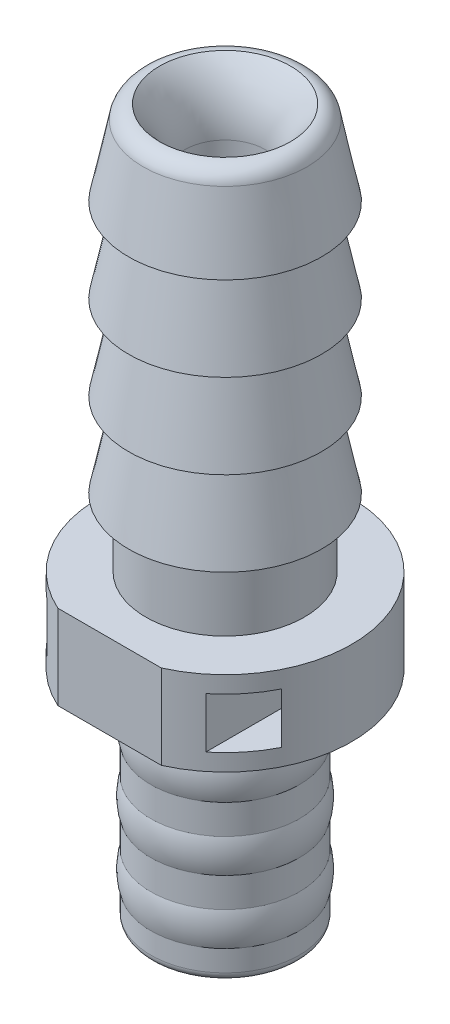
ISO-10303-21;
HEADER;
FILE_DESCRIPTION(('STEP AP214'),'2;1');
FILE_NAME('part.step','',(''),(''),'','','');
FILE_SCHEMA(('AUTOMOTIVE_DESIGN { 1 0 10303 214 1 1 1 1 }'));
ENDSEC;
DATA;
#1=APPLICATION_CONTEXT('core data for automotive mechanical design processes');
#2=APPLICATION_PROTOCOL_DEFINITION('international standard','automotive_design',2000,#1);
#3=PRODUCT_CONTEXT('',#1,'mechanical');
#4=PRODUCT('Part','Part','',(#3));
#5=PRODUCT_RELATED_PRODUCT_CATEGORY('part','',(#4));
#6=PRODUCT_DEFINITION_FORMATION('','',#4);
#7=PRODUCT_DEFINITION_CONTEXT('part definition',#1,'design');
#8=PRODUCT_DEFINITION('design','',#6,#7);
#9=PRODUCT_DEFINITION_SHAPE('','',#8);
#10=(LENGTH_UNIT() NAMED_UNIT(*) SI_UNIT(.MILLI.,.METRE.));
#11=(NAMED_UNIT(*) PLANE_ANGLE_UNIT() SI_UNIT($,.RADIAN.));
#12=(NAMED_UNIT(*) SI_UNIT($,.STERADIAN.) SOLID_ANGLE_UNIT());
#13=UNCERTAINTY_MEASURE_WITH_UNIT(LENGTH_MEASURE(1.E-05),#10,'distance_accuracy_value','');
#14=(GEOMETRIC_REPRESENTATION_CONTEXT(3) GLOBAL_UNCERTAINTY_ASSIGNED_CONTEXT((#13)) GLOBAL_UNIT_ASSIGNED_CONTEXT((#10,
#11,#12)) REPRESENTATION_CONTEXT('',''));
#15=CARTESIAN_POINT('',(0.,0.,0.));
#16=DIRECTION('',(0.,0.,1.));
#17=DIRECTION('',(1.,0.,0.));
#18=AXIS2_PLACEMENT_3D('',#15,#16,#17);
#19=CARTESIAN_POINT('',(0.,7.83692888110823,0.));
#20=DIRECTION('',(0.,-1.,0.));
#21=DIRECTION('',(0.,0.,-1.));
#22=AXIS2_PLACEMENT_3D('',#19,#20,#21);
#23=CYLINDRICAL_SURFACE('',#22,2.4);
#24=CARTESIAN_POINT('',(0.,38.4460627545706,0.));
#25=DIRECTION('',(0.,1.,0.));
#26=DIRECTION('',(0.,0.,1.));
#27=AXIS2_PLACEMENT_3D('',#24,#25,#26);
#28=CIRCLE('',#27,2.4);
#29=CARTESIAN_POINT('',(0.,38.4460627545706,2.4));
#30=VERTEX_POINT('',#29);
#31=EDGE_CURVE('E11',#30,#30,#28,.T.);
#32=ORIENTED_EDGE('',*,*,#31,.T.);
#33=EDGE_LOOP('',(#32));
#34=FACE_BOUND('',#33,.T.);
#35=CARTESIAN_POINT('',(0.,3.57071421427142,0.));
#36=DIRECTION('',(0.,-1.,0.));
#37=DIRECTION('',(0.,0.,-1.));
#38=AXIS2_PLACEMENT_3D('',#35,#36,#37);
#39=CIRCLE('',#38,2.4);
#40=CARTESIAN_POINT('',(0.,3.57071421427142,-2.4));
#41=VERTEX_POINT('',#40);
#42=EDGE_CURVE('E52',#41,#41,#39,.T.);
#43=ORIENTED_EDGE('',*,*,#42,.T.);
#44=EDGE_LOOP('',(#43));
#45=FACE_BOUND('',#44,.T.);
#46=ADVANCED_FACE('F43',(#34,#45),#23,.F.);
#47=CARTESIAN_POINT('',(0.,7.83692888110823,0.));
#48=DIRECTION('',(0.,-1.,0.));
#49=DIRECTION('',(0.,0.,-1.));
#50=AXIS2_PLACEMENT_3D('',#47,#48,#49);
#51=CYLINDRICAL_SURFACE('',#50,4.4);
#52=CARTESIAN_POINT('',(0.,0.5,0.));
#53=DIRECTION('',(0.,-1.,0.));
#54=DIRECTION('',(0.,0.,-1.));
#55=AXIS2_PLACEMENT_3D('',#52,#53,#54);
#56=CIRCLE('',#55,4.4);
#57=CARTESIAN_POINT('',(0.,0.5,-4.4));
#58=VERTEX_POINT('',#57);
#59=EDGE_CURVE('E198',#58,#58,#56,.F.);
#60=ORIENTED_EDGE('',*,*,#59,.T.);
#61=EDGE_LOOP('',(#60));
#62=FACE_BOUND('',#61,.T.);
#63=CARTESIAN_POINT('',(0.,1.75,0.));
#64=DIRECTION('',(0.,-1.,0.));
#65=DIRECTION('',(0.,0.,-1.));
#66=AXIS2_PLACEMENT_3D('',#63,#64,#65);
#67=CIRCLE('',#66,4.4);
#68=CARTESIAN_POINT('',(0.,1.75,-4.4));
#69=VERTEX_POINT('',#68);
#70=EDGE_CURVE('E182',#69,#69,#67,.T.);
#71=ORIENTED_EDGE('',*,*,#70,.T.);
#72=EDGE_LOOP('',(#71));
#73=FACE_BOUND('',#72,.T.);
#74=ADVANCED_FACE('F215',(#62,#73),#51,.T.);
#75=CARTESIAN_POINT('',(0.,2.75,0.));
#76=DIRECTION('',(0.,-1.,0.));
#77=DIRECTION('',(0.,0.,-1.));
#78=AXIS2_PLACEMENT_3D('',#75,#76,#77);
#79=DEGENERATE_TOROIDAL_SURFACE('',#78,1.14166666666668,3.40833333333332,.T.);
#80=CARTESIAN_POINT('',(0.,3.75,0.));
#81=DIRECTION('',(0.,-1.,0.));
#82=DIRECTION('',(0.,0.,-1.));
#83=AXIS2_PLACEMENT_3D('',#80,#81,#82);
#84=CIRCLE('',#83,4.4);
#85=CARTESIAN_POINT('',(0.,3.75,-4.4));
#86=VERTEX_POINT('',#85);
#87=EDGE_CURVE('E178',#86,#86,#84,.T.);
#88=ORIENTED_EDGE('',*,*,#87,.T.);
#89=EDGE_LOOP('',(#88));
#90=FACE_BOUND('',#89,.T.);
#91=ORIENTED_EDGE('',*,*,#70,.F.);
#92=EDGE_LOOP('',(#91));
#93=FACE_BOUND('',#92,.T.);
#94=ADVANCED_FACE('F221',(#90,#93),#79,.T.);
#95=CARTESIAN_POINT('',(0.,7.83692888110823,0.));
#96=DIRECTION('',(0.,-1.,0.));
#97=DIRECTION('',(0.,0.,-1.));
#98=AXIS2_PLACEMENT_3D('',#95,#96,#97);
#99=CYLINDRICAL_SURFACE('',#98,4.4);
#100=CARTESIAN_POINT('',(0.,5.5,0.));
#101=DIRECTION('',(0.,-1.,0.));
#102=DIRECTION('',(0.,0.,-1.));
#103=AXIS2_PLACEMENT_3D('',#100,#101,#102);
#104=CIRCLE('',#103,4.4);
#105=CARTESIAN_POINT('',(0.,5.5,-4.4));
#106=VERTEX_POINT('',#105);
#107=EDGE_CURVE('E174',#106,#106,#104,.T.);
#108=ORIENTED_EDGE('',*,*,#107,.T.);
#109=EDGE_LOOP('',(#108));
#110=FACE_BOUND('',#109,.T.);
#111=ORIENTED_EDGE('',*,*,#87,.F.);
#112=EDGE_LOOP('',(#111));
#113=FACE_BOUND('',#112,.T.);
#114=ADVANCED_FACE('F246',(#110,#113),#99,.T.);
#115=CARTESIAN_POINT('',(0.,6.5,0.));
#116=DIRECTION('',(0.,-1.,0.));
#117=DIRECTION('',(0.,0.,-1.));
#118=AXIS2_PLACEMENT_3D('',#115,#116,#117);
#119=DEGENERATE_TOROIDAL_SURFACE('',#118,1.14166666666668,3.40833333333332,.T.);
#120=CARTESIAN_POINT('',(0.,7.5,0.));
#121=DIRECTION('',(0.,-1.,0.));
#122=DIRECTION('',(0.,0.,-1.));
#123=AXIS2_PLACEMENT_3D('',#120,#121,#122);
#124=CIRCLE('',#123,4.4);
#125=CARTESIAN_POINT('',(0.,7.5,-4.4));
#126=VERTEX_POINT('',#125);
#127=EDGE_CURVE('E170',#126,#126,#124,.T.);
#128=ORIENTED_EDGE('',*,*,#127,.T.);
#129=EDGE_LOOP('',(#128));
#130=FACE_BOUND('',#129,.T.);
#131=ORIENTED_EDGE('',*,*,#107,.F.);
#132=EDGE_LOOP('',(#131));
#133=FACE_BOUND('',#132,.T.);
#134=ADVANCED_FACE('F251',(#130,#133),#119,.T.);
#135=CARTESIAN_POINT('',(0.,7.83692888110823,0.));
#136=DIRECTION('',(0.,-1.,0.));
#137=DIRECTION('',(0.,0.,-1.));
#138=AXIS2_PLACEMENT_3D('',#135,#136,#137);
#139=CYLINDRICAL_SURFACE('',#138,4.4);
#140=CARTESIAN_POINT('',(0.,9.25,0.));
#141=DIRECTION('',(0.,-1.,0.));
#142=DIRECTION('',(0.,0.,-1.));
#143=AXIS2_PLACEMENT_3D('',#140,#141,#142);
#144=CIRCLE('',#143,4.4);
#145=CARTESIAN_POINT('',(0.,9.25,-4.4));
#146=VERTEX_POINT('',#145);
#147=EDGE_CURVE('E166',#146,#146,#144,.T.);
#148=ORIENTED_EDGE('',*,*,#147,.T.);
#149=EDGE_LOOP('',(#148));
#150=FACE_BOUND('',#149,.T.);
#151=ORIENTED_EDGE('',*,*,#127,.F.);
#152=EDGE_LOOP('',(#151));
#153=FACE_BOUND('',#152,.T.);
#154=ADVANCED_FACE('F257',(#150,#153),#139,.T.);
#155=CARTESIAN_POINT('',(0.,10.25,0.));
#156=DIRECTION('',(0.,-1.,0.));
#157=DIRECTION('',(0.,0.,-1.));
#158=AXIS2_PLACEMENT_3D('',#155,#156,#157);
#159=DEGENERATE_TOROIDAL_SURFACE('',#158,1.14166666666668,3.40833333333332,.T.);
#160=CARTESIAN_POINT('',(0.,11.25,0.));
#161=DIRECTION('',(0.,-1.,0.));
#162=DIRECTION('',(0.,0.,-1.));
#163=AXIS2_PLACEMENT_3D('',#160,#161,#162);
#164=CIRCLE('',#163,4.4);
#165=CARTESIAN_POINT('',(0.,11.25,-4.4));
#166=VERTEX_POINT('',#165);
#167=EDGE_CURVE('E162',#166,#166,#164,.T.);
#168=ORIENTED_EDGE('',*,*,#167,.T.);
#169=EDGE_LOOP('',(#168));
#170=FACE_BOUND('',#169,.T.);
#171=ORIENTED_EDGE('',*,*,#147,.F.);
#172=EDGE_LOOP('',(#171));
#173=FACE_BOUND('',#172,.T.);
#174=ADVANCED_FACE('F261',(#170,#173),#159,.T.);
#175=CARTESIAN_POINT('',(0.,7.83692888110823,0.));
#176=DIRECTION('',(0.,-1.,0.));
#177=DIRECTION('',(0.,0.,-1.));
#178=AXIS2_PLACEMENT_3D('',#175,#176,#177);
#179=CYLINDRICAL_SURFACE('',#178,4.4);
#180=CARTESIAN_POINT('',(0.,13.,0.));
#181=DIRECTION('',(0.,-1.,0.));
#182=DIRECTION('',(0.,0.,-1.));
#183=AXIS2_PLACEMENT_3D('',#180,#181,#182);
#184=CIRCLE('',#183,4.4);
#185=CARTESIAN_POINT('',(0.,13.,-4.4));
#186=VERTEX_POINT('',#185);
#187=EDGE_CURVE('E152',#186,#186,#184,.T.);
#188=ORIENTED_EDGE('',*,*,#187,.T.);
#189=EDGE_LOOP('',(#188));
#190=FACE_BOUND('',#189,.T.);
#191=ORIENTED_EDGE('',*,*,#167,.F.);
#192=EDGE_LOOP('',(#191));
#193=FACE_BOUND('',#192,.T.);
#194=ADVANCED_FACE('F265',(#190,#193),#179,.T.);
#195=CARTESIAN_POINT('',(4.4,13.,0.));
#196=DIRECTION('',(0.,-1.,0.));
#197=DIRECTION('',(0.,0.,-1.));
#198=AXIS2_PLACEMENT_3D('',#195,#196,#197);
#199=PLANE('',#198);
#200=DIRECTION('',(1.,0.,0.));
#201=VECTOR('',#200,1.);
#202=CARTESIAN_POINT('',(3.06605424659089,13.,6.84465567848099));
#203=LINE('',#202,#201);
#204=CARTESIAN_POINT('',(-3.06605424659089,13.,6.84465567848099));
#205=VERTEX_POINT('',#204);
#206=CARTESIAN_POINT('',(3.06605424659089,13.,6.84465567848099));
#207=VERTEX_POINT('',#206);
#208=EDGE_CURVE('E143',#205,#207,#203,.T.);
#209=ORIENTED_EDGE('',*,*,#208,.F.);
#210=CARTESIAN_POINT('',(0.,13.,0.));
#211=DIRECTION('',(0.,-1.,0.));
#212=DIRECTION('',(0.,0.,-1.));
#213=AXIS2_PLACEMENT_3D('',#210,#211,#212);
#214=CIRCLE('',#213,7.5);
#215=EDGE_CURVE('E141',#205,#207,#214,.T.);
#216=ORIENTED_EDGE('',*,*,#215,.T.);
#217=EDGE_LOOP('',(#209,#216));
#218=FACE_BOUND('',#217,.T.);
#219=ORIENTED_EDGE('',*,*,#187,.F.);
#220=EDGE_LOOP('',(#219));
#221=FACE_BOUND('',#220,.T.);
#222=ADVANCED_FACE('F269',(#218,#221),#199,.T.);
#223=CARTESIAN_POINT('',(0.,7.83692888110823,0.));
#224=DIRECTION('',(0.,-1.,0.));
#225=DIRECTION('',(0.,0.,-1.));
#226=AXIS2_PLACEMENT_3D('',#223,#224,#225);
#227=CYLINDRICAL_SURFACE('',#226,7.50000000000001);
#228=DIRECTION('',(0.,-1.,0.));
#229=VECTOR('',#228,1.);
#230=CARTESIAN_POINT('',(3.06605424659089,42.001,6.84465567848099));
#231=LINE('',#230,#229);
#232=CARTESIAN_POINT('',(3.0660542465909,18.,6.84465567848099));
#233=VERTEX_POINT('',#232);
#234=EDGE_CURVE('E59',#233,#207,#231,.T.);
#235=ORIENTED_EDGE('',*,*,#234,.T.);
#236=ORIENTED_EDGE('',*,*,#215,.F.);
#237=DIRECTION('',(0.,-1.,0.));
#238=VECTOR('',#237,1.);
#239=CARTESIAN_POINT('',(-3.06605424659089,42.001,6.84465567848099));
#240=LINE('',#239,#238);
#241=CARTESIAN_POINT('',(-3.0660542465909,18.,6.84465567848099));
#242=VERTEX_POINT('',#241);
#243=EDGE_CURVE('E127',#242,#205,#240,.T.);
#244=ORIENTED_EDGE('',*,*,#243,.F.);
#245=CARTESIAN_POINT('',(0.,18.,0.));
#246=DIRECTION('',(0.,-1.,0.));
#247=DIRECTION('',(0.,0.,-1.));
#248=AXIS2_PLACEMENT_3D('',#245,#246,#247);
#249=CIRCLE('',#248,7.50000000000001);
#250=EDGE_CURVE('E139',#242,#233,#249,.T.);
#251=ORIENTED_EDGE('',*,*,#250,.T.);
#252=EDGE_LOOP('',(#235,#236,#244,#251));
#253=FACE_BOUND('',#252,.T.);
#254=CARTESIAN_POINT('',(0.,17.,0.));
#255=DIRECTION('',(0.,1.,0.));
#256=DIRECTION('',(-1.,0.,0.));
#257=AXIS2_PLACEMENT_3D('',#254,#255,#256);
#258=CIRCLE('',#257,7.50000000000001);
#259=CARTESIAN_POINT('',(-6.7,17.,3.37045990927055));
#260=VERTEX_POINT('',#259);
#261=CARTESIAN_POINT('',(-4.7,17.,5.84465567848099));
#262=VERTEX_POINT('',#261);
#263=EDGE_CURVE('E353',#260,#262,#258,.T.);
#264=ORIENTED_EDGE('',*,*,#263,.T.);
#265=DIRECTION('',(0.,-1.,0.));
#266=VECTOR('',#265,1.);
#267=CARTESIAN_POINT('',(-4.7,7.83692888110823,5.84465567848099));
#268=LINE('',#267,#266);
#269=CARTESIAN_POINT('',(-4.7,14.,5.84465567848099));
#270=VERTEX_POINT('',#269);
#271=EDGE_CURVE('E350',#262,#270,#268,.T.);
#272=ORIENTED_EDGE('',*,*,#271,.T.);
#273=CARTESIAN_POINT('',(0.,14.,0.));
#274=DIRECTION('',(0.,1.,0.));
#275=DIRECTION('',(-1.,0.,0.));
#276=AXIS2_PLACEMENT_3D('',#273,#274,#275);
#277=CIRCLE('',#276,7.50000000000001);
#278=CARTESIAN_POINT('',(-6.7,14.,3.37045990927055));
#279=VERTEX_POINT('',#278);
#280=EDGE_CURVE('E459',#279,#270,#277,.T.);
#281=ORIENTED_EDGE('',*,*,#280,.F.);
#282=DIRECTION('',(0.,-1.,0.));
#283=VECTOR('',#282,1.);
#284=CARTESIAN_POINT('',(-6.7,7.83692888110823,3.37045990927055));
#285=LINE('',#284,#283);
#286=EDGE_CURVE('E483',#260,#279,#285,.T.);
#287=ORIENTED_EDGE('',*,*,#286,.F.);
#288=EDGE_LOOP('',(#264,#272,#281,#287));
#289=FACE_BOUND('',#288,.T.);
#290=CARTESIAN_POINT('',(0.,14.,0.));
#291=DIRECTION('',(0.,-1.,0.));
#292=DIRECTION('',(1.,0.,0.));
#293=AXIS2_PLACEMENT_3D('',#290,#291,#292);
#294=CIRCLE('',#293,7.50000000000001);
#295=CARTESIAN_POINT('',(6.7,14.,3.37045990927055));
#296=VERTEX_POINT('',#295);
#297=CARTESIAN_POINT('',(4.7,14.,5.84465567848099));
#298=VERTEX_POINT('',#297);
#299=EDGE_CURVE('E443',#296,#298,#294,.T.);
#300=ORIENTED_EDGE('',*,*,#299,.T.);
#301=DIRECTION('',(0.,-1.,0.));
#302=VECTOR('',#301,1.);
#303=CARTESIAN_POINT('',(4.7,7.83692888110823,5.84465567848099));
#304=LINE('',#303,#302);
#305=CARTESIAN_POINT('',(4.7,17.,5.84465567848099));
#306=VERTEX_POINT('',#305);
#307=EDGE_CURVE('E447',#306,#298,#304,.T.);
#308=ORIENTED_EDGE('',*,*,#307,.F.);
#309=CARTESIAN_POINT('',(0.,17.,0.));
#310=DIRECTION('',(0.,-1.,0.));
#311=DIRECTION('',(1.,0.,0.));
#312=AXIS2_PLACEMENT_3D('',#309,#310,#311);
#313=CIRCLE('',#312,7.50000000000001);
#314=CARTESIAN_POINT('',(6.7,17.,3.37045990927055));
#315=VERTEX_POINT('',#314);
#316=EDGE_CURVE('E133',#315,#306,#313,.T.);
#317=ORIENTED_EDGE('',*,*,#316,.F.);
#318=DIRECTION('',(0.,-1.,0.));
#319=VECTOR('',#318,1.);
#320=CARTESIAN_POINT('',(6.7,7.83692888110823,3.37045990927055));
#321=LINE('',#320,#319);
#322=EDGE_CURVE('E470',#315,#296,#321,.T.);
#323=ORIENTED_EDGE('',*,*,#322,.T.);
#324=EDGE_LOOP('',(#300,#308,#317,#323));
#325=FACE_BOUND('',#324,.T.);
#326=ADVANCED_FACE('F137',(#253,#289,#325),#227,.T.);
#327=CARTESIAN_POINT('',(7.50000000000001,18.,0.));
#328=DIRECTION('',(0.,1.,0.));
#329=DIRECTION('',(0.,0.,1.));
#330=AXIS2_PLACEMENT_3D('',#327,#328,#329);
#331=PLANE('',#330);
#332=DIRECTION('',(1.,0.,0.));
#333=VECTOR('',#332,1.);
#334=CARTESIAN_POINT('',(3.06605424659089,18.,6.84465567848099));
#335=LINE('',#334,#333);
#336=EDGE_CURVE('E124',#242,#233,#335,.T.);
#337=ORIENTED_EDGE('',*,*,#336,.T.);
#338=ORIENTED_EDGE('',*,*,#250,.F.);
#339=EDGE_LOOP('',(#337,#338));
#340=FACE_BOUND('',#339,.T.);
#341=CARTESIAN_POINT('',(0.,18.,0.));
#342=DIRECTION('',(0.,-1.,0.));
#343=DIRECTION('',(0.,0.,-1.));
#344=AXIS2_PLACEMENT_3D('',#341,#342,#343);
#345=CIRCLE('',#344,4.70000000000001);
#346=CARTESIAN_POINT('',(0.,18.,-4.70000000000001));
#347=VERTEX_POINT('',#346);
#348=EDGE_CURVE('E148',#347,#347,#345,.T.);
#349=ORIENTED_EDGE('',*,*,#348,.T.);
#350=EDGE_LOOP('',(#349));
#351=FACE_BOUND('',#350,.T.);
#352=ADVANCED_FACE('F145',(#340,#351),#331,.T.);
#353=CARTESIAN_POINT('',(0.,7.83692888110823,0.));
#354=DIRECTION('',(0.,-1.,0.));
#355=DIRECTION('',(0.,0.,-1.));
#356=AXIS2_PLACEMENT_3D('',#353,#354,#355);
#357=CYLINDRICAL_SURFACE('',#356,4.70000000000001);
#358=CARTESIAN_POINT('',(0.,22.,0.));
#359=DIRECTION('',(0.,-1.,0.));
#360=DIRECTION('',(0.,0.,-1.));
#361=AXIS2_PLACEMENT_3D('',#358,#359,#360);
#362=CIRCLE('',#361,4.70000000000001);
#363=CARTESIAN_POINT('',(0.,22.,-4.70000000000001));
#364=VERTEX_POINT('',#363);
#365=EDGE_CURVE('E155',#364,#364,#362,.T.);
#366=ORIENTED_EDGE('',*,*,#365,.T.);
#367=EDGE_LOOP('',(#366));
#368=FACE_BOUND('',#367,.T.);
#369=ORIENTED_EDGE('',*,*,#348,.F.);
#370=EDGE_LOOP('',(#369));
#371=FACE_BOUND('',#370,.T.);
#372=ADVANCED_FACE('F278',(#368,#371),#357,.T.);
#373=CARTESIAN_POINT('',(4.70000000000001,22.,0.));
#374=DIRECTION('',(0.,-1.,0.));
#375=DIRECTION('',(0.,0.,-1.));
#376=AXIS2_PLACEMENT_3D('',#373,#374,#375);
#377=PLANE('',#376);
#378=CARTESIAN_POINT('',(0.,22.,0.));
#379=DIRECTION('',(0.,-1.,0.));
#380=DIRECTION('',(0.,0.,-1.));
#381=AXIS2_PLACEMENT_3D('',#378,#379,#380);
#382=CIRCLE('',#381,5.71726149711847);
#383=CARTESIAN_POINT('',(0.,22.,-5.71726149711847));
#384=VERTEX_POINT('',#383);
#385=EDGE_CURVE('E408',#384,#384,#382,.T.);
#386=ORIENTED_EDGE('',*,*,#385,.T.);
#387=EDGE_LOOP('',(#386));
#388=FACE_BOUND('',#387,.T.);
#389=ORIENTED_EDGE('',*,*,#365,.F.);
#390=EDGE_LOOP('',(#389));
#391=FACE_BOUND('',#390,.T.);
#392=ADVANCED_FACE('F281',(#388,#391),#377,.T.);
#393=CARTESIAN_POINT('',(0.,22.,0.));
#394=DIRECTION('',(0.,-1.,0.));
#395=DIRECTION('',(0.,0.,-1.));
#396=AXIS2_PLACEMENT_3D('',#393,#394,#395);
#397=CONICAL_SURFACE('',#396,5.71726149711847,0.200712863979341);
#398=CARTESIAN_POINT('',(0.,27.,0.));
#399=DIRECTION('',(0.,-1.,0.));
#400=DIRECTION('',(0.,0.,-1.));
#401=AXIS2_PLACEMENT_3D('',#398,#399,#400);
#402=CIRCLE('',#401,4.70000000000001);
#403=CARTESIAN_POINT('',(0.,27.,-4.70000000000001));
#404=VERTEX_POINT('',#403);
#405=EDGE_CURVE('E404',#404,#404,#402,.T.);
#406=ORIENTED_EDGE('',*,*,#405,.T.);
#407=EDGE_LOOP('',(#406));
#408=FACE_BOUND('',#407,.T.);
#409=ORIENTED_EDGE('',*,*,#385,.F.);
#410=EDGE_LOOP('',(#409));
#411=FACE_BOUND('',#410,.T.);
#412=ADVANCED_FACE('F285',(#408,#411),#397,.T.);
#413=CARTESIAN_POINT('',(4.70000000000001,27.,0.));
#414=DIRECTION('',(0.,-1.,0.));
#415=DIRECTION('',(0.,0.,-1.));
#416=AXIS2_PLACEMENT_3D('',#413,#414,#415);
#417=PLANE('',#416);
#418=CARTESIAN_POINT('',(0.,27.,0.));
#419=DIRECTION('',(0.,-1.,0.));
#420=DIRECTION('',(0.,0.,-1.));
#421=AXIS2_PLACEMENT_3D('',#418,#419,#420);
#422=CIRCLE('',#421,5.71726149711848);
#423=CARTESIAN_POINT('',(0.,27.,-5.71726149711848));
#424=VERTEX_POINT('',#423);
#425=EDGE_CURVE('E400',#424,#424,#422,.T.);
#426=ORIENTED_EDGE('',*,*,#425,.T.);
#427=EDGE_LOOP('',(#426));
#428=FACE_BOUND('',#427,.T.);
#429=ORIENTED_EDGE('',*,*,#405,.F.);
#430=EDGE_LOOP('',(#429));
#431=FACE_BOUND('',#430,.T.);
#432=ADVANCED_FACE('F289',(#428,#431),#417,.T.);
#433=CARTESIAN_POINT('',(0.,27.,0.));
#434=DIRECTION('',(0.,-1.,0.));
#435=DIRECTION('',(0.,0.,-1.));
#436=AXIS2_PLACEMENT_3D('',#433,#434,#435);
#437=CONICAL_SURFACE('',#436,5.71726149711848,0.200712863979341);
#438=CARTESIAN_POINT('',(0.,32.,0.));
#439=DIRECTION('',(0.,-1.,0.));
#440=DIRECTION('',(0.,0.,-1.));
#441=AXIS2_PLACEMENT_3D('',#438,#439,#440);
#442=CIRCLE('',#441,4.70000000000002);
#443=CARTESIAN_POINT('',(0.,32.,-4.70000000000002));
#444=VERTEX_POINT('',#443);
#445=EDGE_CURVE('E396',#444,#444,#442,.T.);
#446=ORIENTED_EDGE('',*,*,#445,.T.);
#447=EDGE_LOOP('',(#446));
#448=FACE_BOUND('',#447,.T.);
#449=ORIENTED_EDGE('',*,*,#425,.F.);
#450=EDGE_LOOP('',(#449));
#451=FACE_BOUND('',#450,.T.);
#452=ADVANCED_FACE('F293',(#448,#451),#437,.T.);
#453=CARTESIAN_POINT('',(4.70000000000002,32.,0.));
#454=DIRECTION('',(0.,-1.,0.));
#455=DIRECTION('',(0.,0.,-1.));
#456=AXIS2_PLACEMENT_3D('',#453,#454,#455);
#457=PLANE('',#456);
#458=CARTESIAN_POINT('',(0.,32.,0.));
#459=DIRECTION('',(0.,-1.,0.));
#460=DIRECTION('',(0.,0.,-1.));
#461=AXIS2_PLACEMENT_3D('',#458,#459,#460);
#462=CIRCLE('',#461,5.71726149711848);
#463=CARTESIAN_POINT('',(0.,32.,-5.71726149711848));
#464=VERTEX_POINT('',#463);
#465=EDGE_CURVE('E392',#464,#464,#462,.T.);
#466=ORIENTED_EDGE('',*,*,#465,.T.);
#467=EDGE_LOOP('',(#466));
#468=FACE_BOUND('',#467,.T.);
#469=ORIENTED_EDGE('',*,*,#445,.F.);
#470=EDGE_LOOP('',(#469));
#471=FACE_BOUND('',#470,.T.);
#472=ADVANCED_FACE('F297',(#468,#471),#457,.T.);
#473=CARTESIAN_POINT('',(0.,32.,0.));
#474=DIRECTION('',(0.,-1.,0.));
#475=DIRECTION('',(0.,0.,-1.));
#476=AXIS2_PLACEMENT_3D('',#473,#474,#475);
#477=CONICAL_SURFACE('',#476,5.71726149711848,0.200712863979341);
#478=CARTESIAN_POINT('',(0.,37.,0.));
#479=DIRECTION('',(0.,-1.,0.));
#480=DIRECTION('',(0.,0.,-1.));
#481=AXIS2_PLACEMENT_3D('',#478,#479,#480);
#482=CIRCLE('',#481,4.70000000000002);
#483=CARTESIAN_POINT('',(0.,37.,-4.70000000000002));
#484=VERTEX_POINT('',#483);
#485=EDGE_CURVE('E388',#484,#484,#482,.T.);
#486=ORIENTED_EDGE('',*,*,#485,.T.);
#487=EDGE_LOOP('',(#486));
#488=FACE_BOUND('',#487,.T.);
#489=ORIENTED_EDGE('',*,*,#465,.F.);
#490=EDGE_LOOP('',(#489));
#491=FACE_BOUND('',#490,.T.);
#492=ADVANCED_FACE('F301',(#488,#491),#477,.T.);
#493=CARTESIAN_POINT('',(4.70000000000002,37.,0.));
#494=DIRECTION('',(0.,-1.,0.));
#495=DIRECTION('',(0.,0.,-1.));
#496=AXIS2_PLACEMENT_3D('',#493,#494,#495);
#497=PLANE('',#496);
#498=CARTESIAN_POINT('',(0.,37.,0.));
#499=DIRECTION('',(0.,-1.,0.));
#500=DIRECTION('',(0.,0.,-1.));
#501=AXIS2_PLACEMENT_3D('',#498,#499,#500);
#502=CIRCLE('',#501,5.71726149711848);
#503=CARTESIAN_POINT('',(0.,37.,-5.71726149711848));
#504=VERTEX_POINT('',#503);
#505=EDGE_CURVE('E384',#504,#504,#502,.T.);
#506=ORIENTED_EDGE('',*,*,#505,.T.);
#507=EDGE_LOOP('',(#506));
#508=FACE_BOUND('',#507,.T.);
#509=ORIENTED_EDGE('',*,*,#485,.F.);
#510=EDGE_LOOP('',(#509));
#511=FACE_BOUND('',#510,.T.);
#512=ADVANCED_FACE('F305',(#508,#511),#497,.T.);
#513=CARTESIAN_POINT('',(0.,37.,0.));
#514=DIRECTION('',(0.,-1.,0.));
#515=DIRECTION('',(0.,0.,-1.));
#516=AXIS2_PLACEMENT_3D('',#513,#514,#515);
#517=CONICAL_SURFACE('',#516,5.71726149711848,0.200712863979341);
#518=CARTESIAN_POINT('',(0.,41.1993679344172,0.));
#519=DIRECTION('',(0.,1.,0.));
#520=DIRECTION('',(0.,0.,1.));
#521=AXIS2_PLACEMENT_3D('',#518,#519,#520);
#522=CIRCLE('',#521,4.86289043473519);
#523=CARTESIAN_POINT('',(0.,41.1993679344172,4.86289043473519));
#524=VERTEX_POINT('',#523);
#525=EDGE_CURVE('E186',#524,#524,#522,.F.);
#526=ORIENTED_EDGE('',*,*,#525,.T.);
#527=EDGE_LOOP('',(#526));
#528=FACE_BOUND('',#527,.T.);
#529=ORIENTED_EDGE('',*,*,#505,.F.);
#530=EDGE_LOOP('',(#529));
#531=FACE_BOUND('',#530,.T.);
#532=ADVANCED_FACE('F230',(#528,#531),#517,.T.);
#533=CARTESIAN_POINT('',(0.,41.,0.));
#534=DIRECTION('',(0.,1.,0.));
#535=DIRECTION('',(0.,0.,1.));
#536=AXIS2_PLACEMENT_3D('',#533,#534,#535);
#537=TOROIDAL_SURFACE('',#536,3.88296573011436,1.);
#538=CARTESIAN_POINT('',(0.,42.,0.));
#539=DIRECTION('',(0.,1.,0.));
#540=DIRECTION('',(0.,0.,1.));
#541=AXIS2_PLACEMENT_3D('',#538,#539,#540);
#542=CIRCLE('',#541,3.88296573011436);
#543=CARTESIAN_POINT('',(0.,42.,3.88296573011436));
#544=VERTEX_POINT('',#543);
#545=EDGE_CURVE('E190',#544,#544,#542,.T.);
#546=ORIENTED_EDGE('',*,*,#545,.F.);
#547=EDGE_LOOP('',(#546));
#548=FACE_BOUND('',#547,.T.);
#549=ORIENTED_EDGE('',*,*,#525,.F.);
#550=EDGE_LOOP('',(#549));
#551=FACE_BOUND('',#550,.T.);
#552=ADVANCED_FACE('F226',(#548,#551),#537,.T.);
#553=CARTESIAN_POINT('',(6.7,0.,7.50100000000001));
#554=DIRECTION('',(1.,0.,0.));
#555=DIRECTION('',(0.,0.,-1.));
#556=AXIS2_PLACEMENT_3D('',#553,#554,#555);
#557=PLANE('',#556);
#558=DIRECTION('',(0.,0.,-1.));
#559=VECTOR('',#558,1.);
#560=CARTESIAN_POINT('',(6.7,17.,7.50100000000001));
#561=LINE('',#560,#559);
#562=CARTESIAN_POINT('',(6.7,17.,0.));
#563=VERTEX_POINT('',#562);
#564=EDGE_CURVE('E448',#315,#563,#561,.T.);
#565=ORIENTED_EDGE('',*,*,#564,.T.);
#566=DIRECTION('',(0.,-1.,0.));
#567=VECTOR('',#566,1.);
#568=CARTESIAN_POINT('',(6.7,0.,0.));
#569=LINE('',#568,#567);
#570=CARTESIAN_POINT('',(6.7,14.,0.));
#571=VERTEX_POINT('',#570);
#572=EDGE_CURVE('E435',#563,#571,#569,.T.);
#573=ORIENTED_EDGE('',*,*,#572,.T.);
#574=DIRECTION('',(0.,0.,-1.));
#575=VECTOR('',#574,1.);
#576=CARTESIAN_POINT('',(6.7,14.,7.50100000000001));
#577=LINE('',#576,#575);
#578=EDGE_CURVE('E441',#296,#571,#577,.T.);
#579=ORIENTED_EDGE('',*,*,#578,.F.);
#580=ORIENTED_EDGE('',*,*,#322,.F.);
#581=EDGE_LOOP('',(#565,#573,#579,#580));
#582=FACE_BOUND('',#581,.T.);
#583=ADVANCED_FACE('F229',(#582),#557,.F.);
#584=CARTESIAN_POINT('',(4.7,0.,7.50100000000001));
#585=DIRECTION('',(1.,0.,0.));
#586=DIRECTION('',(0.,0.,-1.));
#587=AXIS2_PLACEMENT_3D('',#584,#585,#586);
#588=PLANE('',#587);
#589=ORIENTED_EDGE('',*,*,#307,.T.);
#590=DIRECTION('',(0.,0.,-1.));
#591=VECTOR('',#590,1.);
#592=CARTESIAN_POINT('',(4.7,14.,7.50100000000001));
#593=LINE('',#592,#591);
#594=CARTESIAN_POINT('',(4.7,14.,0.));
#595=VERTEX_POINT('',#594);
#596=EDGE_CURVE('E465',#298,#595,#593,.T.);
#597=ORIENTED_EDGE('',*,*,#596,.T.);
#598=DIRECTION('',(0.,-1.,0.));
#599=VECTOR('',#598,1.);
#600=CARTESIAN_POINT('',(4.7,0.,0.));
#601=LINE('',#600,#599);
#602=CARTESIAN_POINT('',(4.7,17.,0.));
#603=VERTEX_POINT('',#602);
#604=EDGE_CURVE('E373',#603,#595,#601,.T.);
#605=ORIENTED_EDGE('',*,*,#604,.F.);
#606=DIRECTION('',(0.,0.,-1.));
#607=VECTOR('',#606,1.);
#608=CARTESIAN_POINT('',(4.7,17.,7.50100000000001));
#609=LINE('',#608,#607);
#610=EDGE_CURVE('E358',#306,#603,#609,.T.);
#611=ORIENTED_EDGE('',*,*,#610,.F.);
#612=EDGE_LOOP('',(#589,#597,#605,#611));
#613=FACE_BOUND('',#612,.T.);
#614=ADVANCED_FACE('F331',(#613),#588,.T.);
#615=CARTESIAN_POINT('',(-6.7,0.,7.50100000000001));
#616=DIRECTION('',(1.,0.,0.));
#617=DIRECTION('',(0.,0.,-1.));
#618=AXIS2_PLACEMENT_3D('',#615,#616,#617);
#619=PLANE('',#618);
#620=ORIENTED_EDGE('',*,*,#286,.T.);
#621=DIRECTION('',(0.,0.,-1.));
#622=VECTOR('',#621,1.);
#623=CARTESIAN_POINT('',(-6.7,14.,7.50100000000001));
#624=LINE('',#623,#622);
#625=CARTESIAN_POINT('',(-6.7,14.,0.));
#626=VERTEX_POINT('',#625);
#627=EDGE_CURVE('E438',#279,#626,#624,.T.);
#628=ORIENTED_EDGE('',*,*,#627,.T.);
#629=DIRECTION('',(0.,-1.,0.));
#630=VECTOR('',#629,1.);
#631=CARTESIAN_POINT('',(-6.7,0.,0.));
#632=LINE('',#631,#630);
#633=CARTESIAN_POINT('',(-6.7,17.,0.));
#634=VERTEX_POINT('',#633);
#635=EDGE_CURVE('E367',#634,#626,#632,.T.);
#636=ORIENTED_EDGE('',*,*,#635,.F.);
#637=DIRECTION('',(0.,0.,-1.));
#638=VECTOR('',#637,1.);
#639=CARTESIAN_POINT('',(-6.7,17.,7.50100000000001));
#640=LINE('',#639,#638);
#641=EDGE_CURVE('E454',#260,#634,#640,.T.);
#642=ORIENTED_EDGE('',*,*,#641,.F.);
#643=EDGE_LOOP('',(#620,#628,#636,#642));
#644=FACE_BOUND('',#643,.T.);
#645=ADVANCED_FACE('F335',(#644),#619,.T.);
#646=CARTESIAN_POINT('',(-4.7,0.,7.50100000000001));
#647=DIRECTION('',(1.,0.,0.));
#648=DIRECTION('',(0.,0.,-1.));
#649=AXIS2_PLACEMENT_3D('',#646,#647,#648);
#650=PLANE('',#649);
#651=DIRECTION('',(0.,0.,-1.));
#652=VECTOR('',#651,1.);
#653=CARTESIAN_POINT('',(-4.7,17.,7.50100000000001));
#654=LINE('',#653,#652);
#655=CARTESIAN_POINT('',(-4.7,17.,0.));
#656=VERTEX_POINT('',#655);
#657=EDGE_CURVE('E344',#262,#656,#654,.T.);
#658=ORIENTED_EDGE('',*,*,#657,.T.);
#659=DIRECTION('',(0.,-1.,0.));
#660=VECTOR('',#659,1.);
#661=CARTESIAN_POINT('',(-4.7,0.,0.));
#662=LINE('',#661,#660);
#663=CARTESIAN_POINT('',(-4.7,14.,0.));
#664=VERTEX_POINT('',#663);
#665=EDGE_CURVE('E347',#656,#664,#662,.T.);
#666=ORIENTED_EDGE('',*,*,#665,.T.);
#667=DIRECTION('',(0.,0.,-1.));
#668=VECTOR('',#667,1.);
#669=CARTESIAN_POINT('',(-4.7,14.,7.50100000000001));
#670=LINE('',#669,#668);
#671=EDGE_CURVE('E69',#270,#664,#670,.T.);
#672=ORIENTED_EDGE('',*,*,#671,.F.);
#673=ORIENTED_EDGE('',*,*,#271,.F.);
#674=EDGE_LOOP('',(#658,#666,#672,#673));
#675=FACE_BOUND('',#674,.T.);
#676=ADVANCED_FACE('F327',(#675),#650,.F.);
#677=CARTESIAN_POINT('',(0.,14.,0.));
#678=DIRECTION('',(0.,1.,0.));
#679=DIRECTION('',(0.,0.,1.));
#680=AXIS2_PLACEMENT_3D('',#677,#678,#679);
#681=PLANE('',#680);
#682=CARTESIAN_POINT('',(0.,14.,0.));
#683=DIRECTION('',(0.,-1.,0.));
#684=DIRECTION('',(0.,0.,-1.));
#685=AXIS2_PLACEMENT_3D('',#682,#683,#684);
#686=CIRCLE('',#685,6.7);
#687=EDGE_CURVE('E380',#626,#571,#686,.T.);
#688=ORIENTED_EDGE('',*,*,#687,.F.);
#689=ORIENTED_EDGE('',*,*,#627,.F.);
#690=ORIENTED_EDGE('',*,*,#280,.T.);
#691=ORIENTED_EDGE('',*,*,#671,.T.);
#692=CARTESIAN_POINT('',(0.,14.,0.));
#693=DIRECTION('',(0.,-1.,0.));
#694=DIRECTION('',(0.,0.,-1.));
#695=AXIS2_PLACEMENT_3D('',#692,#693,#694);
#696=CIRCLE('',#695,4.7);
#697=EDGE_CURVE('E363',#664,#595,#696,.T.);
#698=ORIENTED_EDGE('',*,*,#697,.T.);
#699=ORIENTED_EDGE('',*,*,#596,.F.);
#700=ORIENTED_EDGE('',*,*,#299,.F.);
#701=ORIENTED_EDGE('',*,*,#578,.T.);
#702=EDGE_LOOP('',(#688,#689,#690,#691,#698,#699,#700,#701));
#703=FACE_BOUND('',#702,.T.);
#704=ADVANCED_FACE('F317',(#703),#681,.T.);
#705=CARTESIAN_POINT('',(0.,0.,0.));
#706=DIRECTION('',(0.,-1.,0.));
#707=DIRECTION('',(0.,0.,-1.));
#708=AXIS2_PLACEMENT_3D('',#705,#706,#707);
#709=CYLINDRICAL_SURFACE('',#708,6.7);
#710=CARTESIAN_POINT('',(0.,17.,0.));
#711=DIRECTION('',(0.,-1.,0.));
#712=DIRECTION('',(0.,0.,-1.));
#713=AXIS2_PLACEMENT_3D('',#710,#711,#712);
#714=CIRCLE('',#713,6.7);
#715=EDGE_CURVE('E362',#634,#563,#714,.T.);
#716=ORIENTED_EDGE('',*,*,#715,.F.);
#717=ORIENTED_EDGE('',*,*,#635,.T.);
#718=ORIENTED_EDGE('',*,*,#687,.T.);
#719=ORIENTED_EDGE('',*,*,#572,.F.);
#720=EDGE_LOOP('',(#716,#717,#718,#719));
#721=FACE_BOUND('',#720,.T.);
#722=ADVANCED_FACE('F313',(#721),#709,.F.);
#723=CARTESIAN_POINT('',(0.,17.,0.));
#724=DIRECTION('',(0.,1.,0.));
#725=DIRECTION('',(0.,0.,1.));
#726=AXIS2_PLACEMENT_3D('',#723,#724,#725);
#727=PLANE('',#726);
#728=CARTESIAN_POINT('',(0.,17.,0.));
#729=DIRECTION('',(0.,-1.,0.));
#730=DIRECTION('',(0.,0.,-1.));
#731=AXIS2_PLACEMENT_3D('',#728,#729,#730);
#732=CIRCLE('',#731,4.7);
#733=EDGE_CURVE('E356',#656,#603,#732,.T.);
#734=ORIENTED_EDGE('',*,*,#733,.F.);
#735=ORIENTED_EDGE('',*,*,#657,.F.);
#736=ORIENTED_EDGE('',*,*,#263,.F.);
#737=ORIENTED_EDGE('',*,*,#641,.T.);
#738=ORIENTED_EDGE('',*,*,#715,.T.);
#739=ORIENTED_EDGE('',*,*,#564,.F.);
#740=ORIENTED_EDGE('',*,*,#316,.T.);
#741=ORIENTED_EDGE('',*,*,#610,.T.);
#742=EDGE_LOOP('',(#734,#735,#736,#737,#738,#739,#740,#741));
#743=FACE_BOUND('',#742,.T.);
#744=ADVANCED_FACE('F316',(#743),#727,.F.);
#745=CARTESIAN_POINT('',(0.,0.,0.));
#746=DIRECTION('',(0.,-1.,0.));
#747=DIRECTION('',(0.,0.,-1.));
#748=AXIS2_PLACEMENT_3D('',#745,#746,#747);
#749=CYLINDRICAL_SURFACE('',#748,4.7);
#750=ORIENTED_EDGE('',*,*,#665,.F.);
#751=ORIENTED_EDGE('',*,*,#733,.T.);
#752=ORIENTED_EDGE('',*,*,#604,.T.);
#753=ORIENTED_EDGE('',*,*,#697,.F.);
#754=EDGE_LOOP('',(#750,#751,#752,#753));
#755=FACE_BOUND('',#754,.T.);
#756=ADVANCED_FACE('F237',(#755),#749,.T.);
#757=CARTESIAN_POINT('',(3.06605424659089,42.001,6.84465567848099));
#758=DIRECTION('',(0.,0.,-1.));
#759=DIRECTION('',(-1.,0.,0.));
#760=AXIS2_PLACEMENT_3D('',#757,#758,#759);
#761=PLANE('',#760);
#762=ORIENTED_EDGE('',*,*,#243,.T.);
#763=ORIENTED_EDGE('',*,*,#208,.T.);
#764=ORIENTED_EDGE('',*,*,#234,.F.);
#765=ORIENTED_EDGE('',*,*,#336,.F.);
#766=EDGE_LOOP('',(#762,#763,#764,#765));
#767=FACE_BOUND('',#766,.T.);
#768=ADVANCED_FACE('F126',(#767),#761,.F.);
#769=CARTESIAN_POINT('',(0.,0.5,0.));
#770=DIRECTION('',(0.,-1.,0.));
#771=DIRECTION('',(0.,0.,-1.));
#772=AXIS2_PLACEMENT_3D('',#769,#770,#771);
#773=TOROIDAL_SURFACE('',#772,3.9,0.5);
#774=ORIENTED_EDGE('',*,*,#59,.F.);
#775=EDGE_LOOP('',(#774));
#776=FACE_BOUND('',#775,.T.);
#777=CARTESIAN_POINT('',(0.,0.,0.));
#778=DIRECTION('',(0.,-1.,0.));
#779=DIRECTION('',(0.,0.,-1.));
#780=AXIS2_PLACEMENT_3D('',#777,#778,#779);
#781=CIRCLE('',#780,3.9);
#782=CARTESIAN_POINT('',(0.,0.,-3.9));
#783=VERTEX_POINT('',#782);
#784=EDGE_CURVE('E194',#783,#783,#781,.T.);
#785=ORIENTED_EDGE('',*,*,#784,.F.);
#786=EDGE_LOOP('',(#785));
#787=FACE_BOUND('',#786,.T.);
#788=ADVANCED_FACE('F212',(#776,#787),#773,.T.);
#789=CARTESIAN_POINT('',(0.,38.4460627545706,0.));
#790=DIRECTION('',(0.,1.,0.));
#791=DIRECTION('',(0.,0.,1.));
#792=AXIS2_PLACEMENT_3D('',#789,#790,#791);
#793=TOROIDAL_SURFACE('',#792,7.4,5.);
#794=ORIENTED_EDGE('',*,*,#31,.F.);
#795=EDGE_LOOP('',(#794));
#796=FACE_BOUND('',#795,.T.);
#797=ORIENTED_EDGE('',*,*,#545,.T.);
#798=EDGE_LOOP('',(#797));
#799=FACE_BOUND('',#798,.T.);
#800=ADVANCED_FACE('F207',(#796,#799),#793,.T.);
#801=CARTESIAN_POINT('',(0.,3.57071421427142,0.));
#802=DIRECTION('',(0.,-1.,0.));
#803=DIRECTION('',(0.,0.,-1.));
#804=AXIS2_PLACEMENT_3D('',#801,#802,#803);
#805=TOROIDAL_SURFACE('',#804,7.4,5.);
#806=ORIENTED_EDGE('',*,*,#784,.T.);
#807=EDGE_LOOP('',(#806));
#808=FACE_BOUND('',#807,.T.);
#809=ORIENTED_EDGE('',*,*,#42,.F.);
#810=EDGE_LOOP('',(#809));
#811=FACE_BOUND('',#810,.T.);
#812=ADVANCED_FACE('F45',(#808,#811),#805,.T.);
#813=CLOSED_SHELL('',(#46,#74,#94,#114,#134,#154,#174,#194,#222,#326,#352,#372,#392,#412,#432,
#452,#472,#492,#512,#532,#552,#583,#614,#645,#676,#704,#722,#744,#756,#768,#788,#800,#812));
#814=MANIFOLD_SOLID_BREP('B2',#813);
#815=ADVANCED_BREP_SHAPE_REPRESENTATION('',(#18,#814),#14);
#816=SHAPE_DEFINITION_REPRESENTATION(#9,#815);
ENDSEC;
END-ISO-10303-21;
